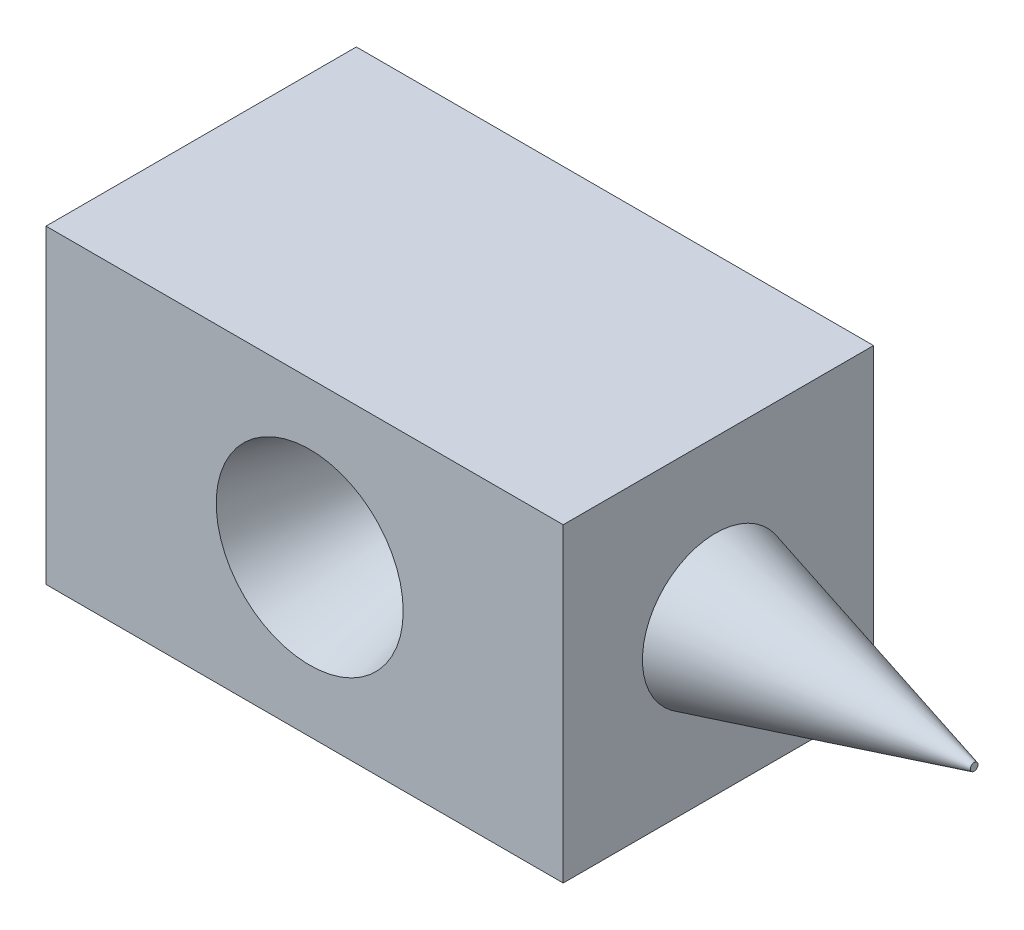
ISO-10303-21;
HEADER;
FILE_DESCRIPTION(('STEP AP214'),'2;1');
FILE_NAME('part.step','',(''),(''),'','','');
FILE_SCHEMA(('AUTOMOTIVE_DESIGN { 1 0 10303 214 1 1 1 1 }'));
ENDSEC;
DATA;
#1=APPLICATION_CONTEXT('core data for automotive mechanical design processes');
#2=APPLICATION_PROTOCOL_DEFINITION('international standard','automotive_design',2000,#1);
#3=PRODUCT_CONTEXT('',#1,'mechanical');
#4=PRODUCT('Part','Part','',(#3));
#5=PRODUCT_RELATED_PRODUCT_CATEGORY('part','',(#4));
#6=PRODUCT_DEFINITION_FORMATION('','',#4);
#7=PRODUCT_DEFINITION_CONTEXT('part definition',#1,'design');
#8=PRODUCT_DEFINITION('design','',#6,#7);
#9=PRODUCT_DEFINITION_SHAPE('','',#8);
#10=(LENGTH_UNIT() NAMED_UNIT(*) SI_UNIT(.MILLI.,.METRE.));
#11=(NAMED_UNIT(*) PLANE_ANGLE_UNIT() SI_UNIT($,.RADIAN.));
#12=(NAMED_UNIT(*) SI_UNIT($,.STERADIAN.) SOLID_ANGLE_UNIT());
#13=UNCERTAINTY_MEASURE_WITH_UNIT(LENGTH_MEASURE(1.E-05),#10,'distance_accuracy_value','');
#14=(GEOMETRIC_REPRESENTATION_CONTEXT(3) GLOBAL_UNCERTAINTY_ASSIGNED_CONTEXT((#13)) GLOBAL_UNIT_ASSIGNED_CONTEXT((#10,
#11,#12)) REPRESENTATION_CONTEXT('',''));
#15=CARTESIAN_POINT('',(0.,0.,0.));
#16=DIRECTION('',(0.,0.,1.));
#17=DIRECTION('',(1.,0.,0.));
#18=AXIS2_PLACEMENT_3D('',#15,#16,#17);
#19=CARTESIAN_POINT('',(127.,0.,76.2));
#20=DIRECTION('',(0.,1.,0.));
#21=DIRECTION('',(-1.,0.,0.));
#22=AXIS2_PLACEMENT_3D('',#19,#20,#21);
#23=PLANE('',#22);
#24=DIRECTION('',(1.,0.,0.));
#25=VECTOR('',#24,1.);
#26=CARTESIAN_POINT('',(127.,0.,0.));
#27=LINE('',#26,#25);
#28=CARTESIAN_POINT('',(0.,0.,0.));
#29=VERTEX_POINT('',#28);
#30=CARTESIAN_POINT('',(127.,0.,0.));
#31=VERTEX_POINT('',#30);
#32=EDGE_CURVE('E99',#29,#31,#27,.T.);
#33=ORIENTED_EDGE('',*,*,#32,.T.);
#34=DIRECTION('',(0.,0.,-1.));
#35=VECTOR('',#34,1.);
#36=CARTESIAN_POINT('',(127.,0.,76.2));
#37=LINE('',#36,#35);
#38=CARTESIAN_POINT('',(127.,0.,76.2));
#39=VERTEX_POINT('',#38);
#40=EDGE_CURVE('E41',#39,#31,#37,.T.);
#41=ORIENTED_EDGE('',*,*,#40,.F.);
#42=DIRECTION('',(1.,0.,0.));
#43=VECTOR('',#42,1.);
#44=CARTESIAN_POINT('',(127.,0.,76.2));
#45=LINE('',#44,#43);
#46=CARTESIAN_POINT('',(0.,0.,76.2));
#47=VERTEX_POINT('',#46);
#48=EDGE_CURVE('E85',#47,#39,#45,.T.);
#49=ORIENTED_EDGE('',*,*,#48,.F.);
#50=DIRECTION('',(0.,0.,-1.));
#51=VECTOR('',#50,1.);
#52=CARTESIAN_POINT('',(0.,0.,76.2));
#53=LINE('',#52,#51);
#54=EDGE_CURVE('E95',#47,#29,#53,.T.);
#55=ORIENTED_EDGE('',*,*,#54,.T.);
#56=EDGE_LOOP('',(#33,#41,#49,#55));
#57=FACE_BOUND('',#56,.T.);
#58=ADVANCED_FACE('F33',(#57),#23,.F.);
#59=CARTESIAN_POINT('',(127.,76.2,76.2));
#60=DIRECTION('',(-1.,0.,0.));
#61=DIRECTION('',(0.,0.,1.));
#62=AXIS2_PLACEMENT_3D('',#59,#60,#61);
#63=PLANE('',#62);
#64=CARTESIAN_POINT('',(127.,37.7543644566918,38.7912710866172));
#65=DIRECTION('',(-1.,0.,0.));
#66=DIRECTION('',(0.,0.,1.));
#67=AXIS2_PLACEMENT_3D('',#64,#65,#66);
#68=CIRCLE('',#67,17.9551335578039);
#69=CARTESIAN_POINT('',(127.,37.7543644566918,20.8361375288134));
#70=VERTEX_POINT('',#69);
#71=EDGE_CURVE('E11',#70,#70,#68,.F.);
#72=ORIENTED_EDGE('',*,*,#71,.F.);
#73=EDGE_LOOP('',(#72));
#74=FACE_BOUND('',#73,.T.);
#75=DIRECTION('',(0.,1.,0.));
#76=VECTOR('',#75,1.);
#77=CARTESIAN_POINT('',(127.,76.2,0.));
#78=LINE('',#77,#76);
#79=CARTESIAN_POINT('',(127.,76.2,0.));
#80=VERTEX_POINT('',#79);
#81=EDGE_CURVE('E90',#31,#80,#78,.T.);
#82=ORIENTED_EDGE('',*,*,#81,.T.);
#83=DIRECTION('',(0.,0.,-1.));
#84=VECTOR('',#83,1.);
#85=CARTESIAN_POINT('',(127.,76.2,76.2));
#86=LINE('',#85,#84);
#87=CARTESIAN_POINT('',(127.,76.2,76.2));
#88=VERTEX_POINT('',#87);
#89=EDGE_CURVE('E88',#88,#80,#86,.T.);
#90=ORIENTED_EDGE('',*,*,#89,.F.);
#91=DIRECTION('',(0.,1.,0.));
#92=VECTOR('',#91,1.);
#93=CARTESIAN_POINT('',(127.,76.2,76.2));
#94=LINE('',#93,#92);
#95=EDGE_CURVE('E80',#39,#88,#94,.T.);
#96=ORIENTED_EDGE('',*,*,#95,.F.);
#97=ORIENTED_EDGE('',*,*,#40,.T.);
#98=EDGE_LOOP('',(#82,#90,#96,#97));
#99=FACE_BOUND('',#98,.T.);
#100=ADVANCED_FACE('F89',(#74,#99),#63,.F.);
#101=CARTESIAN_POINT('',(0.,76.2,76.2));
#102=DIRECTION('',(0.,-1.,0.));
#103=DIRECTION('',(0.,0.,-1.));
#104=AXIS2_PLACEMENT_3D('',#101,#102,#103);
#105=PLANE('',#104);
#106=DIRECTION('',(-1.,0.,0.));
#107=VECTOR('',#106,1.);
#108=CARTESIAN_POINT('',(0.,76.2,0.));
#109=LINE('',#108,#107);
#110=CARTESIAN_POINT('',(0.,76.2,0.));
#111=VERTEX_POINT('',#110);
#112=EDGE_CURVE('E66',#80,#111,#109,.T.);
#113=ORIENTED_EDGE('',*,*,#112,.T.);
#114=DIRECTION('',(0.,0.,-1.));
#115=VECTOR('',#114,1.);
#116=CARTESIAN_POINT('',(0.,76.2,76.2));
#117=LINE('',#116,#115);
#118=CARTESIAN_POINT('',(0.,76.2,76.2));
#119=VERTEX_POINT('',#118);
#120=EDGE_CURVE('E91',#119,#111,#117,.T.);
#121=ORIENTED_EDGE('',*,*,#120,.F.);
#122=DIRECTION('',(-1.,0.,0.));
#123=VECTOR('',#122,1.);
#124=CARTESIAN_POINT('',(0.,76.2,76.2));
#125=LINE('',#124,#123);
#126=EDGE_CURVE('E83',#88,#119,#125,.T.);
#127=ORIENTED_EDGE('',*,*,#126,.F.);
#128=ORIENTED_EDGE('',*,*,#89,.T.);
#129=EDGE_LOOP('',(#113,#121,#127,#128));
#130=FACE_BOUND('',#129,.T.);
#131=ADVANCED_FACE('F93',(#130),#105,.F.);
#132=CARTESIAN_POINT('',(0.,0.,76.2));
#133=DIRECTION('',(1.,0.,0.));
#134=DIRECTION('',(0.,0.,-1.));
#135=AXIS2_PLACEMENT_3D('',#132,#133,#134);
#136=PLANE('',#135);
#137=DIRECTION('',(0.,-1.,0.));
#138=VECTOR('',#137,1.);
#139=CARTESIAN_POINT('',(0.,0.,0.));
#140=LINE('',#139,#138);
#141=EDGE_CURVE('E72',#111,#29,#140,.T.);
#142=ORIENTED_EDGE('',*,*,#141,.T.);
#143=ORIENTED_EDGE('',*,*,#54,.F.);
#144=DIRECTION('',(0.,-1.,0.));
#145=VECTOR('',#144,1.);
#146=CARTESIAN_POINT('',(0.,0.,76.2));
#147=LINE('',#146,#145);
#148=EDGE_CURVE('E49',#119,#47,#147,.T.);
#149=ORIENTED_EDGE('',*,*,#148,.F.);
#150=ORIENTED_EDGE('',*,*,#120,.T.);
#151=EDGE_LOOP('',(#142,#143,#149,#150));
#152=FACE_BOUND('',#151,.T.);
#153=ADVANCED_FACE('F121',(#152),#136,.F.);
#154=CARTESIAN_POINT('',(0.,0.,76.2));
#155=DIRECTION('',(0.,0.,-1.));
#156=DIRECTION('',(-1.,0.,0.));
#157=AXIS2_PLACEMENT_3D('',#154,#155,#156);
#158=PLANE('',#157);
#159=CARTESIAN_POINT('',(64.7532021943691,38.1555866573193,76.2));
#160=DIRECTION('',(0.,0.,1.));
#161=DIRECTION('',(1.,0.,0.));
#162=AXIS2_PLACEMENT_3D('',#159,#160,#161);
#163=CIRCLE('',#162,22.9579812074444);
#164=CARTESIAN_POINT('',(87.7111834018136,38.1555866573193,76.2));
#165=VERTEX_POINT('',#164);
#166=EDGE_CURVE('E194',#165,#165,#163,.T.);
#167=ORIENTED_EDGE('',*,*,#166,.F.);
#168=EDGE_LOOP('',(#167));
#169=FACE_BOUND('',#168,.T.);
#170=ORIENTED_EDGE('',*,*,#48,.T.);
#171=ORIENTED_EDGE('',*,*,#95,.T.);
#172=ORIENTED_EDGE('',*,*,#126,.T.);
#173=ORIENTED_EDGE('',*,*,#148,.T.);
#174=EDGE_LOOP('',(#170,#171,#172,#173));
#175=FACE_BOUND('',#174,.T.);
#176=ADVANCED_FACE('F81',(#169,#175),#158,.F.);
#177=CARTESIAN_POINT('',(0.,0.,0.));
#178=DIRECTION('',(0.,0.,-1.));
#179=DIRECTION('',(-1.,0.,0.));
#180=AXIS2_PLACEMENT_3D('',#177,#178,#179);
#181=PLANE('',#180);
#182=ORIENTED_EDGE('',*,*,#32,.F.);
#183=ORIENTED_EDGE('',*,*,#141,.F.);
#184=ORIENTED_EDGE('',*,*,#112,.F.);
#185=ORIENTED_EDGE('',*,*,#81,.F.);
#186=EDGE_LOOP('',(#182,#183,#184,#185));
#187=FACE_BOUND('',#186,.T.);
#188=ADVANCED_FACE('F110',(#187),#181,.T.);
#189=CARTESIAN_POINT('',(64.7532021943691,38.1555866573193,76.2));
#190=DIRECTION('',(0.,0.,1.));
#191=DIRECTION('',(1.,0.,0.));
#192=AXIS2_PLACEMENT_3D('',#189,#190,#191);
#193=CONICAL_SURFACE('',#192,22.9579812074444,0.26179938779915);
#194=CARTESIAN_POINT('',(64.7532021943691,38.1555866573193,25.4));
#195=DIRECTION('',(0.,0.,1.));
#196=DIRECTION('',(1.,0.,0.));
#197=AXIS2_PLACEMENT_3D('',#194,#195,#196);
#198=CIRCLE('',#197,9.34616223194337);
#199=CARTESIAN_POINT('',(74.0993644263125,38.1555866573193,25.4));
#200=VERTEX_POINT('',#199);
#201=EDGE_CURVE('E102',#200,#200,#198,.T.);
#202=ORIENTED_EDGE('',*,*,#201,.F.);
#203=EDGE_LOOP('',(#202));
#204=FACE_BOUND('',#203,.T.);
#205=ORIENTED_EDGE('',*,*,#166,.T.);
#206=EDGE_LOOP('',(#205));
#207=FACE_BOUND('',#206,.T.);
#208=ADVANCED_FACE('F112',(#204,#207),#193,.F.);
#209=CARTESIAN_POINT('',(64.7532021943691,38.1555866573193,25.4));
#210=DIRECTION('',(0.,0.,1.));
#211=DIRECTION('',(1.,0.,0.));
#212=AXIS2_PLACEMENT_3D('',#209,#210,#211);
#213=PLANE('',#212);
#214=ORIENTED_EDGE('',*,*,#201,.T.);
#215=EDGE_LOOP('',(#214));
#216=FACE_BOUND('',#215,.T.);
#217=ADVANCED_FACE('F118',(#216),#213,.T.);
#218=CARTESIAN_POINT('',(127.,37.7543644566918,38.7912710866172));
#219=DIRECTION('',(-1.,0.,0.));
#220=DIRECTION('',(0.,0.,-1.));
#221=AXIS2_PLACEMENT_3D('',#218,#219,#220);
#222=CONICAL_SURFACE('',#221,17.9551335578039,0.26179938779915);
#223=CARTESIAN_POINT('',(190.5,37.7543644566918,38.7912710866172));
#224=DIRECTION('',(1.,0.,0.));
#225=DIRECTION('',(0.,0.,-1.));
#226=AXIS2_PLACEMENT_3D('',#223,#224,#225);
#227=CIRCLE('',#226,0.940359838427529);
#228=CARTESIAN_POINT('',(190.5,37.7543644566918,37.8509112481897));
#229=VERTEX_POINT('',#228);
#230=EDGE_CURVE('E193',#229,#229,#227,.T.);
#231=CARTESIAN_POINT('',(190.5,37.7543644566918,37.8509112481897));
#232=CARTESIAN_POINT('',(189.838541666667,37.7543644566918,37.6736740219462));
#233=CARTESIAN_POINT('',(189.177083333333,37.7543644566918,37.4964367957027));
#234=CARTESIAN_POINT('',(187.854166666667,37.7543644566918,37.1419623432157));
#235=CARTESIAN_POINT('',(187.192708333333,37.7543644566918,36.9647251169722));
#236=CARTESIAN_POINT('',(185.869791666667,37.7543644566918,36.6102506644852));
#237=CARTESIAN_POINT('',(185.208333333333,37.7543644566918,36.4330134382417));
#238=CARTESIAN_POINT('',(183.885416666667,37.7543644566918,36.0785389857547));
#239=CARTESIAN_POINT('',(183.223958333333,37.7543644566918,35.9013017595112));
#240=CARTESIAN_POINT('',(181.901041666667,37.7543644566918,35.5468273070242));
#241=CARTESIAN_POINT('',(181.239583333333,37.7543644566918,35.3695900807807));
#242=CARTESIAN_POINT('',(179.916666666667,37.7543644566918,35.0151156282936));
#243=CARTESIAN_POINT('',(179.255208333333,37.7543644566918,34.8378784020501));
#244=CARTESIAN_POINT('',(177.932291666667,37.7543644566918,34.4834039495631));
#245=CARTESIAN_POINT('',(177.270833333333,37.7543644566918,34.3061667233196));
#246=CARTESIAN_POINT('',(175.947916666667,37.7543644566918,33.9516922708326));
#247=CARTESIAN_POINT('',(175.286458333333,37.7543644566918,33.7744550445891));
#248=CARTESIAN_POINT('',(173.963541666667,37.7543644566918,33.4199805921021));
#249=CARTESIAN_POINT('',(173.302083333333,37.7543644566918,33.2427433658586));
#250=CARTESIAN_POINT('',(171.979166666667,37.7543644566918,32.8882689133716));
#251=CARTESIAN_POINT('',(171.317708333333,37.7543644566918,32.7110316871281));
#252=CARTESIAN_POINT('',(169.994791666667,37.7543644566918,32.3565572346411));
#253=CARTESIAN_POINT('',(169.333333333333,37.7543644566918,32.1793200083976));
#254=CARTESIAN_POINT('',(168.010416666667,37.7543644566918,31.8248455559106));
#255=CARTESIAN_POINT('',(167.348958333333,37.7543644566918,31.6476083296671));
#256=CARTESIAN_POINT('',(166.026041666667,37.7543644566918,31.2931338771801));
#257=CARTESIAN_POINT('',(165.364583333333,37.7543644566918,31.1158966509366));
#258=CARTESIAN_POINT('',(164.041666666667,37.7543644566918,30.7614221984496));
#259=CARTESIAN_POINT('',(163.380208333333,37.7543644566918,30.5841849722061));
#260=CARTESIAN_POINT('',(162.057291666667,37.7543644566918,30.2297105197191));
#261=CARTESIAN_POINT('',(161.395833333333,37.7543644566918,30.0524732934756));
#262=CARTESIAN_POINT('',(160.072916666667,37.7543644566918,29.6979988409886));
#263=CARTESIAN_POINT('',(159.411458333333,37.7543644566918,29.520761614745));
#264=CARTESIAN_POINT('',(158.088541666667,37.7543644566918,29.166287162258));
#265=CARTESIAN_POINT('',(157.427083333333,37.7543644566918,28.9890499360145));
#266=CARTESIAN_POINT('',(156.104166666667,37.7543644566918,28.6345754835275));
#267=CARTESIAN_POINT('',(155.442708333333,37.7543644566918,28.457338257284));
#268=CARTESIAN_POINT('',(154.119791666667,37.7543644566918,28.102863804797));
#269=CARTESIAN_POINT('',(153.458333333333,37.7543644566918,27.9256265785535));
#270=CARTESIAN_POINT('',(152.135416666667,37.7543644566918,27.5711521260665));
#271=CARTESIAN_POINT('',(151.473958333333,37.7543644566918,27.393914899823));
#272=CARTESIAN_POINT('',(150.151041666667,37.7543644566918,27.039440447336));
#273=CARTESIAN_POINT('',(149.489583333333,37.7543644566918,26.8622032210925));
#274=CARTESIAN_POINT('',(148.166666666667,37.7543644566918,26.5077287686055));
#275=CARTESIAN_POINT('',(147.505208333333,37.7543644566918,26.330491542362));
#276=CARTESIAN_POINT('',(146.182291666667,37.7543644566918,25.976017089875));
#277=CARTESIAN_POINT('',(145.520833333333,37.7543644566918,25.7987798636315));
#278=CARTESIAN_POINT('',(144.197916666667,37.7543644566918,25.4443054111445));
#279=CARTESIAN_POINT('',(143.536458333333,37.7543644566918,25.267068184901));
#280=CARTESIAN_POINT('',(142.213541666667,37.7543644566918,24.912593732414));
#281=CARTESIAN_POINT('',(141.552083333333,37.7543644566918,24.7353565061705));
#282=CARTESIAN_POINT('',(140.229166666667,37.7543644566918,24.3808820536835));
#283=CARTESIAN_POINT('',(139.567708333333,37.7543644566918,24.2036448274399));
#284=CARTESIAN_POINT('',(138.244791666667,37.7543644566918,23.8491703749529));
#285=CARTESIAN_POINT('',(137.583333333333,37.7543644566918,23.6719331487094));
#286=CARTESIAN_POINT('',(136.260416666667,37.7543644566918,23.3174586962224));
#287=CARTESIAN_POINT('',(135.598958333333,37.7543644566918,23.1402214699789));
#288=CARTESIAN_POINT('',(134.276041666667,37.7543644566918,22.7857470174919));
#289=CARTESIAN_POINT('',(133.614583333333,37.7543644566918,22.6085097912484));
#290=CARTESIAN_POINT('',(132.291666666667,37.7543644566918,22.2540353387614));
#291=CARTESIAN_POINT('',(131.630208333333,37.7543644566918,22.0767981125179));
#292=CARTESIAN_POINT('',(130.307291666667,37.7543644566918,21.7223236600309));
#293=CARTESIAN_POINT('',(129.645833333333,37.7543644566918,21.5450864337874));
#294=CARTESIAN_POINT('',(128.322916666667,37.7543644566918,21.1906119813004));
#295=CARTESIAN_POINT('',(127.661458333333,37.7543644566918,21.0133747550569));
#296=CARTESIAN_POINT('',(127.,37.7543644566918,20.8361375288134));
#297=B_SPLINE_CURVE_WITH_KNOTS('',3,(#231,#232,#233,#234,#235,#236,#237,#238,#239,#240,#241,
#242,#243,#244,#245,#246,#247,#248,#249,#250,#251,#252,#253,#254,#255,#256,#257,#258,#259,#260,
#261,#262,#263,#264,#265,#266,#267,#268,#269,#270,#271,#272,#273,#274,#275,#276,#277,#278,#279,
#280,#281,#282,#283,#284,#285,#286,#287,#288,#289,#290,#291,#292,#293,#294,#295,#296),
.UNSPECIFIED.,.F.,.F.,(4,2,2,2,2,2,2,2,2,2,2,2,2,2,2,2,2,2,2,2,2,2,2,2,2,2,2,2,2,2,2,2,4),(0.,
2.05437617050127,4.10875234100251,6.16312851150378,8.21750468200502,10.2718808525063,
12.3262570230075,14.3806331935088,16.4350093640101,18.4893855345113,20.5437617050126,
22.5981378755139,24.6525140460151,26.7068902165163,28.7612663870176,30.8156425575189,
32.8700187280201,34.9243948985214,36.9787710690227,39.0331472395239,41.0875234100251,
43.1418995805264,45.1962757510277,47.2506519215289,49.3050280920302,51.3594042625315,
53.4137804330327,55.4681566035339,57.5225327740352,59.5769089445365,61.6312851150377,
63.685661285539,65.7400374560403),.UNSPECIFIED.);
#298=EDGE_CURVE('BSEAM160',#229,#70,#297,.T.);
#299=ORIENTED_EDGE('',*,*,#230,.F.);
#300=ORIENTED_EDGE('',*,*,#71,.T.);
#301=ORIENTED_EDGE('',*,*,#298,.T.);
#302=ORIENTED_EDGE('',*,*,#298,.F.);
#303=EDGE_LOOP('',(#299,#301,#300,#302));
#304=FACE_BOUND('',#303,.T.);
#305=ADVANCED_FACE('F160',(#304),#222,.T.);
#306=CARTESIAN_POINT('',(190.5,37.7543644566918,38.7912710866172));
#307=DIRECTION('',(1.,0.,0.));
#308=DIRECTION('',(0.,0.,-1.));
#309=AXIS2_PLACEMENT_3D('',#306,#307,#308);
#310=PLANE('',#309);
#311=ORIENTED_EDGE('',*,*,#230,.T.);
#312=EDGE_LOOP('',(#311));
#313=FACE_BOUND('',#312,.T.);
#314=ADVANCED_FACE('F177',(#313),#310,.T.);
#315=CLOSED_SHELL('',(#58,#100,#131,#153,#176,#188,#208,#217,#305,#314));
#316=MANIFOLD_SOLID_BREP('B2',#315);
#317=ADVANCED_BREP_SHAPE_REPRESENTATION('',(#18,#316),#14);
#318=SHAPE_DEFINITION_REPRESENTATION(#9,#317);
ENDSEC;
END-ISO-10303-21;
